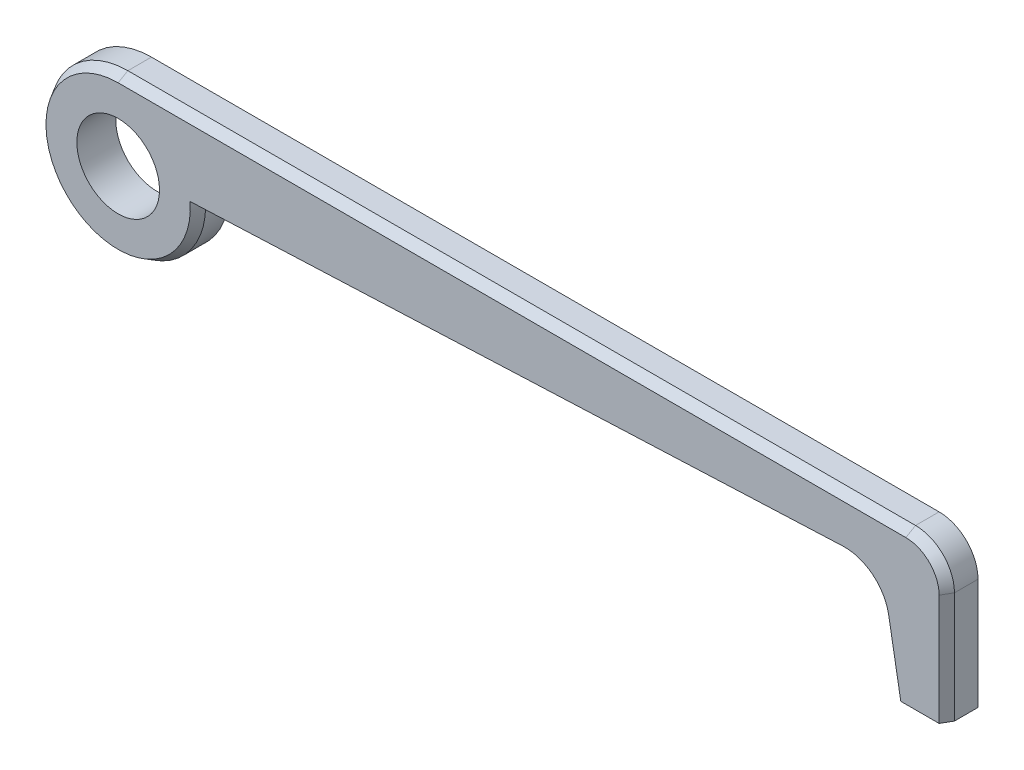
ISO-10303-21;
HEADER;
FILE_DESCRIPTION(('STEP AP214'),'2;1');
FILE_NAME('part.step','',(''),(''),'','','');
FILE_SCHEMA(('AUTOMOTIVE_DESIGN { 1 0 10303 214 1 1 1 1 }'));
ENDSEC;
DATA;
#1=APPLICATION_CONTEXT('core data for automotive mechanical design processes');
#2=APPLICATION_PROTOCOL_DEFINITION('international standard','automotive_design',2000,#1);
#3=PRODUCT_CONTEXT('',#1,'mechanical');
#4=PRODUCT('Part','Part','',(#3));
#5=PRODUCT_RELATED_PRODUCT_CATEGORY('part','',(#4));
#6=PRODUCT_DEFINITION_FORMATION('','',#4);
#7=PRODUCT_DEFINITION_CONTEXT('part definition',#1,'design');
#8=PRODUCT_DEFINITION('design','',#6,#7);
#9=PRODUCT_DEFINITION_SHAPE('','',#8);
#10=(LENGTH_UNIT() NAMED_UNIT(*) SI_UNIT(.MILLI.,.METRE.));
#11=(NAMED_UNIT(*) PLANE_ANGLE_UNIT() SI_UNIT($,.RADIAN.));
#12=(NAMED_UNIT(*) SI_UNIT($,.STERADIAN.) SOLID_ANGLE_UNIT());
#13=UNCERTAINTY_MEASURE_WITH_UNIT(LENGTH_MEASURE(1.E-05),#10,'distance_accuracy_value','');
#14=(GEOMETRIC_REPRESENTATION_CONTEXT(3) GLOBAL_UNCERTAINTY_ASSIGNED_CONTEXT((#13)) GLOBAL_UNIT_ASSIGNED_CONTEXT((#10,
#11,#12)) REPRESENTATION_CONTEXT('',''));
#15=CARTESIAN_POINT('',(0.,0.,0.));
#16=DIRECTION('',(0.,0.,1.));
#17=DIRECTION('',(1.,0.,0.));
#18=AXIS2_PLACEMENT_3D('',#15,#16,#17);
#19=CARTESIAN_POINT('',(81.,4.,4.));
#20=DIRECTION('',(0.,0.,-1.));
#21=DIRECTION('',(-1.,0.,0.));
#22=AXIS2_PLACEMENT_3D('',#19,#20,#21);
#23=PLANE('',#22);
#24=DIRECTION('',(0.173648177666926,-0.984807753012209,0.));
#25=VECTOR('',#24,1.);
#26=CARTESIAN_POINT('',(78.5466118509547,3.56740147517293,4.));
#27=LINE('',#26,#25);
#28=CARTESIAN_POINT('',(79.2376082910954,-0.351434073217302,4.));
#29=VERTEX_POINT('',#28);
#30=CARTESIAN_POINT('',(80.4844543979371,-7.42264973081036,4.));
#31=VERTEX_POINT('',#30);
#32=EDGE_CURVE('E53',#29,#31,#27,.T.);
#33=ORIENTED_EDGE('',*,*,#32,.T.);
#34=DIRECTION('',(1.,0.,0.));
#35=VECTOR('',#34,1.);
#36=CARTESIAN_POINT('',(81.,-7.42264973081036,4.));
#37=LINE('',#36,#35);
#38=CARTESIAN_POINT('',(84.4226497308104,-7.42264973081036,4.));
#39=VERTEX_POINT('',#38);
#40=EDGE_CURVE('E11',#31,#39,#37,.T.);
#41=ORIENTED_EDGE('',*,*,#40,.T.);
#42=DIRECTION('',(0.,1.,0.));
#43=VECTOR('',#42,1.);
#44=CARTESIAN_POINT('',(84.4226497308104,4.,4.));
#45=LINE('',#44,#43);
#46=CARTESIAN_POINT('',(84.4226497308104,4.,4.));
#47=VERTEX_POINT('',#46);
#48=EDGE_CURVE('E269',#39,#47,#45,.T.);
#49=ORIENTED_EDGE('',*,*,#48,.T.);
#50=CARTESIAN_POINT('',(81.,4.,4.));
#51=DIRECTION('',(0.,0.,-1.));
#52=DIRECTION('',(-1.,0.,0.));
#53=AXIS2_PLACEMENT_3D('',#50,#51,#52);
#54=CIRCLE('',#53,3.42264973081038);
#55=CARTESIAN_POINT('',(81.,7.42264973081038,4.));
#56=VERTEX_POINT('',#55);
#57=EDGE_CURVE('E267',#47,#56,#54,.F.);
#58=ORIENTED_EDGE('',*,*,#57,.T.);
#59=DIRECTION('',(-1.,0.,0.));
#60=VECTOR('',#59,1.);
#61=CARTESIAN_POINT('',(81.,7.42264973081038,4.));
#62=LINE('',#61,#60);
#63=CARTESIAN_POINT('',(0.,7.42264973081038,4.));
#64=VERTEX_POINT('',#63);
#65=EDGE_CURVE('E263',#56,#64,#62,.T.);
#66=ORIENTED_EDGE('',*,*,#65,.T.);
#67=CARTESIAN_POINT('',(0.,0.,4.));
#68=DIRECTION('',(0.,0.,-1.));
#69=DIRECTION('',(-1.,0.,0.));
#70=AXIS2_PLACEMENT_3D('',#67,#68,#69);
#71=CIRCLE('',#70,7.42264973081038);
#72=CARTESIAN_POINT('',(7.40207539489738,0.552276085444782,4.));
#73=VERTEX_POINT('',#72);
#74=EDGE_CURVE('E265',#64,#73,#71,.F.);
#75=ORIENTED_EDGE('',*,*,#74,.T.);
#76=DIRECTION('',(0.99908447434526,0.0427809901972354,0.));
#77=VECTOR('',#76,1.);
#78=CARTESIAN_POINT('',(81.0126621182814,3.70429562922719,4.));
#79=LINE('',#78,#77);
#80=CARTESIAN_POINT('',(74.5339746807494,3.42687698158216,4.));
#81=VERTEX_POINT('',#80);
#82=EDGE_CURVE('E271',#73,#81,#79,.T.);
#83=ORIENTED_EDGE('',*,*,#82,.T.);
#84=CARTESIAN_POINT('',(74.7297982577449,-1.14628260600531,4.));
#85=DIRECTION('',(0.,0.,-1.));
#86=DIRECTION('',(-1.,0.,0.));
#87=AXIS2_PLACEMENT_3D('',#84,#85,#86);
#88=CIRCLE('',#87,4.57735026918964);
#89=EDGE_CURVE('E64',#81,#29,#88,.T.);
#90=ORIENTED_EDGE('',*,*,#89,.T.);
#91=EDGE_LOOP('',(#33,#41,#49,#58,#66,#75,#83,#90));
#92=FACE_BOUND('',#91,.T.);
#93=CARTESIAN_POINT('',(0.,0.,4.));
#94=DIRECTION('',(0.,0.,1.));
#95=DIRECTION('',(1.,0.,0.));
#96=AXIS2_PLACEMENT_3D('',#93,#94,#95);
#97=CIRCLE('',#96,4.25);
#98=CARTESIAN_POINT('',(4.25,0.,4.));
#99=VERTEX_POINT('',#98);
#100=EDGE_CURVE('E389',#99,#99,#97,.T.);
#101=ORIENTED_EDGE('',*,*,#100,.F.);
#102=EDGE_LOOP('',(#101));
#103=FACE_BOUND('',#102,.T.);
#104=ADVANCED_FACE('F43',(#92,#103),#23,.F.);
#105=CARTESIAN_POINT('',(81.,4.,0.));
#106=DIRECTION('',(0.,0.,-1.));
#107=DIRECTION('',(-1.,0.,0.));
#108=AXIS2_PLACEMENT_3D('',#105,#106,#107);
#109=PLANE('',#108);
#110=DIRECTION('',(1.,0.,0.));
#111=VECTOR('',#110,1.);
#112=CARTESIAN_POINT('',(81.,6.99999999999998,0.));
#113=LINE('',#112,#111);
#114=CARTESIAN_POINT('',(0.,6.99999999999999,0.));
#115=VERTEX_POINT('',#114);
#116=CARTESIAN_POINT('',(81.,6.99999999999998,0.));
#117=VERTEX_POINT('',#116);
#118=EDGE_CURVE('E239',#115,#117,#113,.T.);
#119=ORIENTED_EDGE('',*,*,#118,.T.);
#120=CARTESIAN_POINT('',(81.,4.,0.));
#121=DIRECTION('',(0.,0.,-1.));
#122=DIRECTION('',(-1.,0.,0.));
#123=AXIS2_PLACEMENT_3D('',#120,#121,#122);
#124=CIRCLE('',#123,2.99999999999999);
#125=CARTESIAN_POINT('',(84.,4.,0.));
#126=VERTEX_POINT('',#125);
#127=EDGE_CURVE('E241',#117,#126,#124,.T.);
#128=ORIENTED_EDGE('',*,*,#127,.T.);
#129=DIRECTION('',(0.,-1.,0.));
#130=VECTOR('',#129,1.);
#131=CARTESIAN_POINT('',(84.,-7.99999999999999,0.));
#132=LINE('',#131,#130);
#133=CARTESIAN_POINT('',(84.,-7.42264973081036,0.));
#134=VERTEX_POINT('',#133);
#135=EDGE_CURVE('E236',#126,#134,#132,.T.);
#136=ORIENTED_EDGE('',*,*,#135,.T.);
#137=DIRECTION('',(-1.,0.,0.));
#138=VECTOR('',#137,1.);
#139=CARTESIAN_POINT('',(80.,-7.42264973081036,0.));
#140=LINE('',#139,#138);
#141=CARTESIAN_POINT('',(80.9136241821084,-7.42264973081036,0.));
#142=VERTEX_POINT('',#141);
#143=EDGE_CURVE('E226',#134,#142,#140,.T.);
#144=ORIENTED_EDGE('',*,*,#143,.T.);
#145=DIRECTION('',(-0.173648177666926,0.984807753012209,0.));
#146=VECTOR('',#145,1.);
#147=CARTESIAN_POINT('',(79.6538370228059,-0.278041717670662,0.));
#148=LINE('',#147,#146);
#149=CARTESIAN_POINT('',(79.6538370228059,-0.278041717670662,0.));
#150=VERTEX_POINT('',#149);
#151=EDGE_CURVE('E228',#142,#150,#148,.T.);
#152=ORIENTED_EDGE('',*,*,#151,.T.);
#153=CARTESIAN_POINT('',(74.7297982577449,-1.14628260600531,0.));
#154=DIRECTION('',(0.,0.,-1.));
#155=DIRECTION('',(-1.,0.,0.));
#156=AXIS2_PLACEMENT_3D('',#153,#154,#155);
#157=CIRCLE('',#156,5.00000000000002);
#158=CARTESIAN_POINT('',(74.5158933067587,3.84913976572101,0.));
#159=VERTEX_POINT('',#158);
#160=EDGE_CURVE('E230',#150,#159,#157,.F.);
#161=ORIENTED_EDGE('',*,*,#160,.T.);
#162=DIRECTION('',(-0.99908447434526,-0.0427809901972354,0.));
#163=VECTOR('',#162,1.);
#164=CARTESIAN_POINT('',(7.95721900980276,0.999084474345274,0.));
#165=LINE('',#164,#163);
#166=CARTESIAN_POINT('',(6.93450917493685,0.955291841646535,0.));
#167=VERTEX_POINT('',#166);
#168=EDGE_CURVE('E232',#159,#167,#165,.T.);
#169=ORIENTED_EDGE('',*,*,#168,.T.);
#170=CARTESIAN_POINT('',(0.,0.,0.));
#171=DIRECTION('',(0.,0.,-1.));
#172=DIRECTION('',(-1.,0.,0.));
#173=AXIS2_PLACEMENT_3D('',#170,#171,#172);
#174=CIRCLE('',#173,6.99999999999999);
#175=EDGE_CURVE('E234',#167,#115,#174,.T.);
#176=ORIENTED_EDGE('',*,*,#175,.T.);
#177=EDGE_LOOP('',(#119,#128,#136,#144,#152,#161,#169,#176));
#178=FACE_BOUND('',#177,.T.);
#179=CARTESIAN_POINT('',(0.,0.,0.));
#180=DIRECTION('',(0.,0.,1.));
#181=DIRECTION('',(1.,0.,0.));
#182=AXIS2_PLACEMENT_3D('',#179,#180,#181);
#183=CIRCLE('',#182,4.25);
#184=CARTESIAN_POINT('',(4.25,0.,0.));
#185=VERTEX_POINT('',#184);
#186=EDGE_CURVE('E383',#185,#185,#183,.T.);
#187=ORIENTED_EDGE('',*,*,#186,.T.);
#188=EDGE_LOOP('',(#187));
#189=FACE_BOUND('',#188,.T.);
#190=ADVANCED_FACE('F463',(#178,#189),#109,.T.);
#191=CARTESIAN_POINT('',(81.,4.,4.));
#192=DIRECTION('',(0.,0.,-1.));
#193=DIRECTION('',(-1.,0.,0.));
#194=AXIS2_PLACEMENT_3D('',#191,#192,#193);
#195=CYLINDRICAL_SURFACE('',#194,4.);
#196=DIRECTION('',(0.,0.,-1.));
#197=VECTOR('',#196,1.);
#198=CARTESIAN_POINT('',(85.,4.,4.));
#199=LINE('',#198,#197);
#200=CARTESIAN_POINT('',(85.,4.,3.));
#201=VERTEX_POINT('',#200);
#202=CARTESIAN_POINT('',(85.,4.,0.577350269189626));
#203=VERTEX_POINT('',#202);
#204=EDGE_CURVE('E394',#201,#203,#199,.T.);
#205=ORIENTED_EDGE('',*,*,#204,.T.);
#206=CARTESIAN_POINT('',(81.,4.,0.577350269189626));
#207=DIRECTION('',(0.,0.,-1.));
#208=DIRECTION('',(-1.,0.,0.));
#209=AXIS2_PLACEMENT_3D('',#206,#207,#208);
#210=CIRCLE('',#209,4.);
#211=CARTESIAN_POINT('',(81.,8.,0.577350269189626));
#212=VERTEX_POINT('',#211);
#213=EDGE_CURVE('E245',#203,#212,#210,.F.);
#214=ORIENTED_EDGE('',*,*,#213,.T.);
#215=DIRECTION('',(0.,0.,-1.));
#216=VECTOR('',#215,1.);
#217=CARTESIAN_POINT('',(81.,8.,4.));
#218=LINE('',#217,#216);
#219=CARTESIAN_POINT('',(81.,8.,3.));
#220=VERTEX_POINT('',#219);
#221=EDGE_CURVE('E204',#220,#212,#218,.T.);
#222=ORIENTED_EDGE('',*,*,#221,.F.);
#223=CARTESIAN_POINT('',(81.,4.,3.));
#224=DIRECTION('',(0.,0.,-1.));
#225=DIRECTION('',(-1.,0.,0.));
#226=AXIS2_PLACEMENT_3D('',#223,#224,#225);
#227=CIRCLE('',#226,4.);
#228=EDGE_CURVE('E243',#220,#201,#227,.T.);
#229=ORIENTED_EDGE('',*,*,#228,.T.);
#230=EDGE_LOOP('',(#205,#214,#222,#229));
#231=FACE_BOUND('',#230,.T.);
#232=ADVANCED_FACE('F491',(#231),#195,.T.);
#233=CARTESIAN_POINT('',(0.,8.,4.));
#234=DIRECTION('',(0.,-1.,0.));
#235=DIRECTION('',(1.,0.,0.));
#236=AXIS2_PLACEMENT_3D('',#233,#234,#235);
#237=PLANE('',#236);
#238=ORIENTED_EDGE('',*,*,#221,.T.);
#239=DIRECTION('',(-1.,0.,0.));
#240=VECTOR('',#239,1.);
#241=CARTESIAN_POINT('',(0.,8.,0.577350269189626));
#242=LINE('',#241,#240);
#243=CARTESIAN_POINT('',(0.,8.,0.577350269189626));
#244=VERTEX_POINT('',#243);
#245=EDGE_CURVE('E253',#212,#244,#242,.T.);
#246=ORIENTED_EDGE('',*,*,#245,.T.);
#247=DIRECTION('',(0.,0.,-1.));
#248=VECTOR('',#247,1.);
#249=CARTESIAN_POINT('',(0.,8.,4.));
#250=LINE('',#249,#248);
#251=CARTESIAN_POINT('',(0.,8.,3.));
#252=VERTEX_POINT('',#251);
#253=EDGE_CURVE('E207',#252,#244,#250,.T.);
#254=ORIENTED_EDGE('',*,*,#253,.F.);
#255=DIRECTION('',(1.,0.,0.));
#256=VECTOR('',#255,1.);
#257=CARTESIAN_POINT('',(0.,8.,3.));
#258=LINE('',#257,#256);
#259=EDGE_CURVE('E251',#252,#220,#258,.T.);
#260=ORIENTED_EDGE('',*,*,#259,.T.);
#261=EDGE_LOOP('',(#238,#246,#254,#260));
#262=FACE_BOUND('',#261,.T.);
#263=ADVANCED_FACE('F512',(#262),#237,.F.);
#264=CARTESIAN_POINT('',(0.,0.,4.));
#265=DIRECTION('',(0.,0.,-1.));
#266=DIRECTION('',(-1.,0.,0.));
#267=AXIS2_PLACEMENT_3D('',#264,#265,#266);
#268=CYLINDRICAL_SURFACE('',#267,8.);
#269=ORIENTED_EDGE('',*,*,#253,.T.);
#270=CARTESIAN_POINT('',(0.,0.,0.577350269189626));
#271=DIRECTION('',(0.,0.,-1.));
#272=DIRECTION('',(-1.,0.,0.));
#273=AXIS2_PLACEMENT_3D('',#270,#271,#272);
#274=CIRCLE('',#273,8.);
#275=CARTESIAN_POINT('',(8.,0.,0.577350269189626));
#276=VERTEX_POINT('',#275);
#277=EDGE_CURVE('E249',#244,#276,#274,.F.);
#278=ORIENTED_EDGE('',*,*,#277,.T.);
#279=DIRECTION('',(0.,0.,-1.));
#280=VECTOR('',#279,1.);
#281=CARTESIAN_POINT('',(8.,0.,4.));
#282=LINE('',#281,#280);
#283=CARTESIAN_POINT('',(8.,0.,3.));
#284=VERTEX_POINT('',#283);
#285=EDGE_CURVE('E405',#284,#276,#282,.T.);
#286=ORIENTED_EDGE('',*,*,#285,.F.);
#287=CARTESIAN_POINT('',(0.,0.,3.));
#288=DIRECTION('',(0.,0.,-1.));
#289=DIRECTION('',(-1.,0.,0.));
#290=AXIS2_PLACEMENT_3D('',#287,#288,#289);
#291=CIRCLE('',#290,8.);
#292=EDGE_CURVE('E247',#284,#252,#291,.T.);
#293=ORIENTED_EDGE('',*,*,#292,.T.);
#294=EDGE_LOOP('',(#269,#278,#286,#293));
#295=FACE_BOUND('',#294,.T.);
#296=ADVANCED_FACE('F411',(#295),#268,.T.);
#297=CARTESIAN_POINT('',(74.5586742969559,2.85005529137573,4.));
#298=DIRECTION('',(-0.0427809901972353,0.99908447434526,0.));
#299=DIRECTION('',(-0.99908447434526,-0.0427809901972353,0.));
#300=AXIS2_PLACEMENT_3D('',#297,#298,#299);
#301=PLANE('',#300);
#302=ORIENTED_EDGE('',*,*,#285,.T.);
#303=DIRECTION('',(0.99908447434526,0.0427809901972353,0.));
#304=VECTOR('',#303,1.);
#305=CARTESIAN_POINT('',(74.5586742969559,2.85005529137573,0.577350269189626));
#306=LINE('',#305,#304);
#307=CARTESIAN_POINT('',(74.5586742969559,2.85005529137573,0.577350269189626));
#308=VERTEX_POINT('',#307);
#309=EDGE_CURVE('E257',#276,#308,#306,.T.);
#310=ORIENTED_EDGE('',*,*,#309,.T.);
#311=DIRECTION('',(0.,0.,-1.));
#312=VECTOR('',#311,1.);
#313=CARTESIAN_POINT('',(74.5586742969559,2.85005529137573,4.));
#314=LINE('',#313,#312);
#315=CARTESIAN_POINT('',(74.5586742969559,2.85005529137573,2.99999999999997));
#316=VERTEX_POINT('',#315);
#317=EDGE_CURVE('E402',#316,#308,#314,.T.);
#318=ORIENTED_EDGE('',*,*,#317,.F.);
#319=DIRECTION('',(-0.99908447434526,-0.0427809901972353,0.));
#320=VECTOR('',#319,1.);
#321=CARTESIAN_POINT('',(74.5586742969559,2.85005529137573,2.99999999999997));
#322=LINE('',#321,#320);
#323=EDGE_CURVE('E255',#316,#284,#322,.T.);
#324=ORIENTED_EDGE('',*,*,#323,.T.);
#325=EDGE_LOOP('',(#302,#310,#318,#324));
#326=FACE_BOUND('',#325,.T.);
#327=ADVANCED_FACE('F430',(#326),#301,.F.);
#328=CARTESIAN_POINT('',(74.7297982577449,-1.14628260600531,4.));
#329=DIRECTION('',(0.,0.,-1.));
#330=DIRECTION('',(-1.,0.,0.));
#331=AXIS2_PLACEMENT_3D('',#328,#329,#330);
#332=CYLINDRICAL_SURFACE('',#331,4.);
#333=ORIENTED_EDGE('',*,*,#317,.T.);
#334=CARTESIAN_POINT('',(74.7297982577449,-1.14628260600531,0.577350269189626));
#335=DIRECTION('',(0.,0.,-1.));
#336=DIRECTION('',(-1.,0.,0.));
#337=AXIS2_PLACEMENT_3D('',#334,#335,#336);
#338=CIRCLE('',#337,4.);
#339=CARTESIAN_POINT('',(78.6690292697937,-0.451689895337592,0.577350269189626));
#340=VERTEX_POINT('',#339);
#341=EDGE_CURVE('E261',#308,#340,#338,.T.);
#342=ORIENTED_EDGE('',*,*,#341,.T.);
#343=DIRECTION('',(0.,0.,-1.));
#344=VECTOR('',#343,1.);
#345=CARTESIAN_POINT('',(78.6690292697937,-0.451689895337592,4.));
#346=LINE('',#345,#344);
#347=CARTESIAN_POINT('',(78.6690292697937,-0.451689895337592,2.99999999999997));
#348=VERTEX_POINT('',#347);
#349=EDGE_CURVE('E399',#348,#340,#346,.T.);
#350=ORIENTED_EDGE('',*,*,#349,.F.);
#351=CARTESIAN_POINT('',(74.7297982577449,-1.14628260600531,2.99999999999997));
#352=DIRECTION('',(0.,0.,-1.));
#353=DIRECTION('',(-1.,0.,0.));
#354=AXIS2_PLACEMENT_3D('',#351,#352,#353);
#355=CIRCLE('',#354,4.);
#356=EDGE_CURVE('E259',#348,#316,#355,.F.);
#357=ORIENTED_EDGE('',*,*,#356,.T.);
#358=EDGE_LOOP('',(#333,#342,#350,#357));
#359=FACE_BOUND('',#358,.T.);
#360=ADVANCED_FACE('F433',(#359),#332,.F.);
#361=CARTESIAN_POINT('',(80.,-7.99999999999999,4.));
#362=DIRECTION('',(0.984807753012209,0.173648177666926,0.));
#363=DIRECTION('',(-0.173648177666926,0.984807753012209,0.));
#364=AXIS2_PLACEMENT_3D('',#361,#362,#363);
#365=PLANE('',#364);
#366=ORIENTED_EDGE('',*,*,#349,.T.);
#367=DIRECTION('',(0.173648177666926,-0.984807753012209,0.));
#368=VECTOR('',#367,1.);
#369=CARTESIAN_POINT('',(80.,-7.99999999999999,0.577350269189626));
#370=LINE('',#369,#368);
#371=CARTESIAN_POINT('',(79.8263518223331,-7.01519224698777,0.577350269189626));
#372=VERTEX_POINT('',#371);
#373=EDGE_CURVE('E219',#340,#372,#370,.T.);
#374=ORIENTED_EDGE('',*,*,#373,.T.);
#375=DIRECTION('',(0.,0.,1.));
#376=VECTOR('',#375,1.);
#377=CARTESIAN_POINT('',(79.8263518223331,-7.01519224698777,4.));
#378=LINE('',#377,#376);
#379=CARTESIAN_POINT('',(79.8263518223331,-7.01519224698777,2.99999999999997));
#380=VERTEX_POINT('',#379);
#381=EDGE_CURVE('E216',#372,#380,#378,.T.);
#382=ORIENTED_EDGE('',*,*,#381,.T.);
#383=DIRECTION('',(-0.173648177666926,0.984807753012209,0.));
#384=VECTOR('',#383,1.);
#385=CARTESIAN_POINT('',(80.,-7.99999999999999,2.99999999999997));
#386=LINE('',#385,#384);
#387=EDGE_CURVE('E214',#380,#348,#386,.T.);
#388=ORIENTED_EDGE('',*,*,#387,.T.);
#389=EDGE_LOOP('',(#366,#374,#382,#388));
#390=FACE_BOUND('',#389,.T.);
#391=ADVANCED_FACE('F502',(#390),#365,.F.);
#392=CARTESIAN_POINT('',(85.,-7.99999999999999,4.));
#393=DIRECTION('',(0.,1.,0.));
#394=DIRECTION('',(0.,0.,1.));
#395=AXIS2_PLACEMENT_3D('',#392,#393,#394);
#396=PLANE('',#395);
#397=DIRECTION('',(-1.,0.,0.));
#398=VECTOR('',#397,1.);
#399=CARTESIAN_POINT('',(85.,-7.99999999999999,2.99999999999999));
#400=LINE('',#399,#398);
#401=CARTESIAN_POINT('',(84.,-7.99999999999999,2.99999999999999));
#402=VERTEX_POINT('',#401);
#403=CARTESIAN_POINT('',(80.6527036446661,-7.99999999999999,2.99999999999999));
#404=VERTEX_POINT('',#403);
#405=EDGE_CURVE('E173',#402,#404,#400,.T.);
#406=ORIENTED_EDGE('',*,*,#405,.T.);
#407=DIRECTION('',(0.,0.,-1.));
#408=VECTOR('',#407,1.);
#409=CARTESIAN_POINT('',(80.6527036446661,-7.99999999999999,4.));
#410=LINE('',#409,#408);
#411=CARTESIAN_POINT('',(80.6527036446661,-7.99999999999999,1.00000000000001));
#412=VERTEX_POINT('',#411);
#413=EDGE_CURVE('E212',#404,#412,#410,.T.);
#414=ORIENTED_EDGE('',*,*,#413,.T.);
#415=DIRECTION('',(1.,0.,0.));
#416=VECTOR('',#415,1.);
#417=CARTESIAN_POINT('',(85.,-7.99999999999999,1.00000000000001));
#418=LINE('',#417,#416);
#419=CARTESIAN_POINT('',(84.,-7.99999999999999,1.00000000000001));
#420=VERTEX_POINT('',#419);
#421=EDGE_CURVE('E176',#412,#420,#418,.T.);
#422=ORIENTED_EDGE('',*,*,#421,.T.);
#423=DIRECTION('',(0.,0.,1.));
#424=VECTOR('',#423,1.);
#425=CARTESIAN_POINT('',(84.,-7.99999999999999,4.));
#426=LINE('',#425,#424);
#427=EDGE_CURVE('E168',#420,#402,#426,.T.);
#428=ORIENTED_EDGE('',*,*,#427,.T.);
#429=EDGE_LOOP('',(#406,#414,#422,#428));
#430=FACE_BOUND('',#429,.T.);
#431=ADVANCED_FACE('F170',(#430),#396,.F.);
#432=CARTESIAN_POINT('',(85.,4.,4.));
#433=DIRECTION('',(-1.,0.,0.));
#434=DIRECTION('',(0.,0.,1.));
#435=AXIS2_PLACEMENT_3D('',#432,#433,#434);
#436=PLANE('',#435);
#437=DIRECTION('',(0.,0.,-1.));
#438=VECTOR('',#437,1.);
#439=CARTESIAN_POINT('',(85.,-7.42264973081036,4.));
#440=LINE('',#439,#438);
#441=CARTESIAN_POINT('',(85.,-7.42264973081036,3.));
#442=VERTEX_POINT('',#441);
#443=CARTESIAN_POINT('',(85.,-7.42264973081036,0.577350269189626));
#444=VERTEX_POINT('',#443);
#445=EDGE_CURVE('E186',#442,#444,#440,.T.);
#446=ORIENTED_EDGE('',*,*,#445,.T.);
#447=DIRECTION('',(0.,1.,0.));
#448=VECTOR('',#447,1.);
#449=CARTESIAN_POINT('',(85.,4.,0.577350269189626));
#450=LINE('',#449,#448);
#451=EDGE_CURVE('E224',#444,#203,#450,.T.);
#452=ORIENTED_EDGE('',*,*,#451,.T.);
#453=ORIENTED_EDGE('',*,*,#204,.F.);
#454=DIRECTION('',(0.,-1.,0.));
#455=VECTOR('',#454,1.);
#456=CARTESIAN_POINT('',(85.,4.,3.));
#457=LINE('',#456,#455);
#458=EDGE_CURVE('E221',#201,#442,#457,.T.);
#459=ORIENTED_EDGE('',*,*,#458,.T.);
#460=EDGE_LOOP('',(#446,#452,#453,#459));
#461=FACE_BOUND('',#460,.T.);
#462=ADVANCED_FACE('F496',(#461),#436,.F.);
#463=CARTESIAN_POINT('',(0.,0.,4.));
#464=DIRECTION('',(0.,0.,-1.));
#465=DIRECTION('',(-1.,0.,0.));
#466=AXIS2_PLACEMENT_3D('',#463,#464,#465);
#467=CYLINDRICAL_SURFACE('',#466,4.25);
#468=ORIENTED_EDGE('',*,*,#100,.T.);
#469=EDGE_LOOP('',(#468));
#470=FACE_BOUND('',#469,.T.);
#471=ORIENTED_EDGE('',*,*,#186,.F.);
#472=EDGE_LOOP('',(#471));
#473=FACE_BOUND('',#472,.T.);
#474=ADVANCED_FACE('F494',(#470,#473),#467,.F.);
#475=CARTESIAN_POINT('',(81.,7.42264973081038,4.));
#476=DIRECTION('',(0.,-0.866025403784441,-0.499999999999996));
#477=DIRECTION('',(-1.,0.,0.));
#478=AXIS2_PLACEMENT_3D('',#475,#476,#477);
#479=PLANE('',#478);
#480=DIRECTION('',(0.,-0.499999999999996,0.866025403784441));
#481=VECTOR('',#480,1.);
#482=CARTESIAN_POINT('',(81.,8.,3.));
#483=LINE('',#482,#481);
#484=EDGE_CURVE('E376',#220,#56,#483,.T.);
#485=ORIENTED_EDGE('',*,*,#484,.F.);
#486=ORIENTED_EDGE('',*,*,#259,.F.);
#487=DIRECTION('',(0.,0.499999999999996,-0.866025403784441));
#488=VECTOR('',#487,1.);
#489=CARTESIAN_POINT('',(0.,7.42264973081038,4.));
#490=LINE('',#489,#488);
#491=EDGE_CURVE('E48',#64,#252,#490,.T.);
#492=ORIENTED_EDGE('',*,*,#491,.F.);
#493=ORIENTED_EDGE('',*,*,#65,.F.);
#494=EDGE_LOOP('',(#485,#486,#492,#493));
#495=FACE_BOUND('',#494,.T.);
#496=ADVANCED_FACE('F46',(#495),#479,.F.);
#497=CARTESIAN_POINT('',(0.,8.,0.577350269189626));
#498=DIRECTION('',(0.,0.499999999999995,-0.866025403784442));
#499=DIRECTION('',(1.,0.,0.));
#500=AXIS2_PLACEMENT_3D('',#497,#498,#499);
#501=PLANE('',#500);
#502=DIRECTION('',(0.,-0.866025403784442,-0.499999999999995));
#503=VECTOR('',#502,1.);
#504=CARTESIAN_POINT('',(0.,8.,0.577350269189626));
#505=LINE('',#504,#503);
#506=EDGE_CURVE('E370',#244,#115,#505,.T.);
#507=ORIENTED_EDGE('',*,*,#506,.F.);
#508=ORIENTED_EDGE('',*,*,#245,.F.);
#509=DIRECTION('',(0.,0.866025403784442,0.499999999999995));
#510=VECTOR('',#509,1.);
#511=CARTESIAN_POINT('',(81.,6.99999999999998,0.));
#512=LINE('',#511,#510);
#513=EDGE_CURVE('E374',#117,#212,#512,.T.);
#514=ORIENTED_EDGE('',*,*,#513,.F.);
#515=ORIENTED_EDGE('',*,*,#118,.F.);
#516=EDGE_LOOP('',(#507,#508,#514,#515));
#517=FACE_BOUND('',#516,.T.);
#518=ADVANCED_FACE('F419',(#517),#501,.T.);
#519=CARTESIAN_POINT('',(0.,0.,4.));
#520=DIRECTION('',(0.,0.,-1.));
#521=DIRECTION('',(-1.,0.,0.));
#522=AXIS2_PLACEMENT_3D('',#519,#520,#521);
#523=CONICAL_SURFACE('',#522,7.42264973081038,0.523598775598294);
#524=ORIENTED_EDGE('',*,*,#491,.T.);
#525=ORIENTED_EDGE('',*,*,#292,.F.);
#526=CARTESIAN_POINT('',(8.,0.,3.));
#527=CARTESIAN_POINT('',(7.95154488824458,0.0464242482554917,3.08392600802668));
#528=CARTESIAN_POINT('',(7.90276501667539,0.0927559872493881,3.16771599633575));
#529=CARTESIAN_POINT('',(7.80453098496049,0.185220811682596,3.3350021739237));
#530=CARTESIAN_POINT('',(7.75507686205437,0.231353907909457,3.41849837911065));
#531=CARTESIAN_POINT('',(7.65546396730925,0.32341316802569,3.58518491397713));
#532=CARTESIAN_POINT('',(7.60530519170116,0.369339330806472,3.66837524201758));
#533=CARTESIAN_POINT('',(7.50425025414602,0.460974424125055,3.8344346247685));
#534=CARTESIAN_POINT('',(7.45335405178271,0.506683342572589,3.91730366155197));
#535=CARTESIAN_POINT('',(7.40207539489738,0.552276085444783,4.));
#536=B_SPLINE_CURVE_WITH_KNOTS('',3,(#526,#527,#528,#529,#530,#531,#532,#533,#534,#535),
.UNSPECIFIED.,.F.,.F.,(4,2,2,2,4),(0.,0.322366217253327,0.644714701437641,0.967064910469044,
1.28943285393488),.UNSPECIFIED.);
#537=EDGE_CURVE('E363',#73,#284,#536,.F.);
#538=ORIENTED_EDGE('',*,*,#537,.F.);
#539=ORIENTED_EDGE('',*,*,#74,.F.);
#540=EDGE_LOOP('',(#524,#525,#538,#539));
#541=FACE_BOUND('',#540,.T.);
#542=ADVANCED_FACE('F359',(#541),#523,.T.);
#543=CARTESIAN_POINT('',(81.,4.,4.));
#544=DIRECTION('',(0.,0.,-1.));
#545=DIRECTION('',(-1.,0.,0.));
#546=AXIS2_PLACEMENT_3D('',#543,#544,#545);
#547=CONICAL_SURFACE('',#546,3.42264973081038,0.523598775598292);
#548=ORIENTED_EDGE('',*,*,#484,.T.);
#549=ORIENTED_EDGE('',*,*,#57,.F.);
#550=DIRECTION('',(-0.499999999999996,0.,0.866025403784441));
#551=VECTOR('',#550,1.);
#552=CARTESIAN_POINT('',(85.,4.,3.));
#553=LINE('',#552,#551);
#554=EDGE_CURVE('E371',#201,#47,#553,.T.);
#555=ORIENTED_EDGE('',*,*,#554,.F.);
#556=ORIENTED_EDGE('',*,*,#228,.F.);
#557=EDGE_LOOP('',(#548,#549,#555,#556));
#558=FACE_BOUND('',#557,.T.);
#559=ADVANCED_FACE('F473',(#558),#547,.T.);
#560=CARTESIAN_POINT('',(81.,4.,0.577350269189626));
#561=DIRECTION('',(0.,0.,1.));
#562=DIRECTION('',(1.,0.,0.));
#563=AXIS2_PLACEMENT_3D('',#560,#561,#562);
#564=CONICAL_SURFACE('',#563,4.,1.0471975511966);
#565=ORIENTED_EDGE('',*,*,#513,.T.);
#566=ORIENTED_EDGE('',*,*,#213,.F.);
#567=DIRECTION('',(0.866025403784442,0.,0.499999999999995));
#568=VECTOR('',#567,1.);
#569=CARTESIAN_POINT('',(84.,4.,0.));
#570=LINE('',#569,#568);
#571=EDGE_CURVE('E316',#126,#203,#570,.T.);
#572=ORIENTED_EDGE('',*,*,#571,.F.);
#573=ORIENTED_EDGE('',*,*,#127,.F.);
#574=EDGE_LOOP('',(#565,#566,#572,#573));
#575=FACE_BOUND('',#574,.T.);
#576=ADVANCED_FACE('F469',(#575),#564,.T.);
#577=CARTESIAN_POINT('',(0.,0.,0.577350269189626));
#578=DIRECTION('',(0.,0.,1.));
#579=DIRECTION('',(1.,0.,0.));
#580=AXIS2_PLACEMENT_3D('',#577,#578,#579);
#581=CONICAL_SURFACE('',#580,8.,1.0471975511966);
#582=ORIENTED_EDGE('',*,*,#506,.T.);
#583=ORIENTED_EDGE('',*,*,#175,.F.);
#584=CARTESIAN_POINT('',(8.,0.,0.577350269189626));
#585=CARTESIAN_POINT('',(7.91426904767773,0.0821366636745368,0.527854538401581));
#586=CARTESIAN_POINT('',(7.8278127874648,0.163705737956558,0.478668290659739));
#587=CARTESIAN_POINT('',(7.65341155552637,0.325593683997525,0.380980168505512));
#588=CARTESIAN_POINT('',(7.56546701992183,0.40591290920634,0.332478100987598));
#589=CARTESIAN_POINT('',(7.387997660858,0.56523729671164,0.236192913438387));
#590=CARTESIAN_POINT('',(7.2984727636831,0.644242397375467,0.188409827137399));
#591=CARTESIAN_POINT('',(7.11775378510326,0.800851081967291,0.0936108515779761));
#592=CARTESIAN_POINT('',(7.02655922995955,0.878454255312517,0.0465951874514234));
#593=CARTESIAN_POINT('',(6.93450917493685,0.955291841646535,0.));
#594=B_SPLINE_CURVE_WITH_KNOTS('',3,(#584,#585,#586,#587,#588,#589,#590,#591,#592,#593),
.UNSPECIFIED.,.F.,.F.,(4,2,2,2,4),(0.,0.385893457599977,0.771675727464502,1.15747603985305,
1.54338756749755),.UNSPECIFIED.);
#595=EDGE_CURVE('E307',#276,#167,#594,.T.);
#596=ORIENTED_EDGE('',*,*,#595,.F.);
#597=ORIENTED_EDGE('',*,*,#277,.F.);
#598=EDGE_LOOP('',(#582,#583,#596,#597));
#599=FACE_BOUND('',#598,.T.);
#600=ADVANCED_FACE('F319',(#599),#581,.T.);
#601=CARTESIAN_POINT('',(81.0126621182814,3.70429562922719,4.));
#602=DIRECTION('',(-0.0370494243098589,0.865232535309619,-0.499999999999998));
#603=DIRECTION('',(0.99908447434526,0.0427809901972353,0.));
#604=AXIS2_PLACEMENT_3D('',#601,#602,#603);
#605=PLANE('',#604);
#606=ORIENTED_EDGE('',*,*,#537,.T.);
#607=ORIENTED_EDGE('',*,*,#323,.F.);
#608=DIRECTION('',(0.0213904950986191,-0.499542237172629,-0.866025403784439));
#609=VECTOR('',#608,1.);
#610=CARTESIAN_POINT('',(74.5339746807494,3.42687698158216,4.));
#611=LINE('',#610,#609);
#612=EDGE_CURVE('E304',#81,#316,#611,.T.);
#613=ORIENTED_EDGE('',*,*,#612,.F.);
#614=ORIENTED_EDGE('',*,*,#82,.F.);
#615=EDGE_LOOP('',(#606,#607,#613,#614));
#616=FACE_BOUND('',#615,.T.);
#617=ADVANCED_FACE('F350',(#616),#605,.F.);
#618=CARTESIAN_POINT('',(84.4226497308104,4.,4.));
#619=DIRECTION('',(-0.866025403784441,0.,-0.499999999999996));
#620=DIRECTION('',(0.,1.,0.));
#621=AXIS2_PLACEMENT_3D('',#618,#619,#620);
#622=PLANE('',#621);
#623=ORIENTED_EDGE('',*,*,#554,.T.);
#624=ORIENTED_EDGE('',*,*,#48,.F.);
#625=DIRECTION('',(0.499999999999996,0.,-0.866025403784441));
#626=VECTOR('',#625,1.);
#627=CARTESIAN_POINT('',(84.75,-7.42264973081036,3.43301270189221));
#628=LINE('',#627,#626);
#629=EDGE_CURVE('E190',#442,#39,#628,.F.);
#630=ORIENTED_EDGE('',*,*,#629,.F.);
#631=ORIENTED_EDGE('',*,*,#458,.F.);
#632=EDGE_LOOP('',(#623,#624,#630,#631));
#633=FACE_BOUND('',#632,.T.);
#634=ADVANCED_FACE('F344',(#633),#622,.F.);
#635=CARTESIAN_POINT('',(85.,-7.42264973081036,4.));
#636=DIRECTION('',(-0.499999999999995,0.866025403784441,0.));
#637=DIRECTION('',(0.,0.,-1.));
#638=AXIS2_PLACEMENT_3D('',#635,#636,#637);
#639=PLANE('',#638);
#640=DIRECTION('',(0.813259170127463,0.469535400794016,-0.343723769333447));
#641=VECTOR('',#640,1.);
#642=CARTESIAN_POINT('',(84.5,-7.71132486540518,0.78867513459482));
#643=LINE('',#642,#641);
#644=EDGE_CURVE('E191',#444,#420,#643,.F.);
#645=ORIENTED_EDGE('',*,*,#644,.F.);
#646=ORIENTED_EDGE('',*,*,#445,.F.);
#647=DIRECTION('',(-0.866025403784441,-0.499999999999995,0.));
#648=VECTOR('',#647,1.);
#649=CARTESIAN_POINT('',(84.,-7.99999999999999,2.99999999999999));
#650=LINE('',#649,#648);
#651=EDGE_CURVE('E183',#402,#442,#650,.F.);
#652=ORIENTED_EDGE('',*,*,#651,.F.);
#653=ORIENTED_EDGE('',*,*,#427,.F.);
#654=EDGE_LOOP('',(#645,#646,#652,#653));
#655=FACE_BOUND('',#654,.T.);
#656=ADVANCED_FACE('F185',(#655),#639,.F.);
#657=CARTESIAN_POINT('',(85.,4.,0.577350269189626));
#658=DIRECTION('',(0.499999999999995,0.,-0.866025403784442));
#659=DIRECTION('',(0.,-1.,0.));
#660=AXIS2_PLACEMENT_3D('',#657,#658,#659);
#661=PLANE('',#660);
#662=ORIENTED_EDGE('',*,*,#571,.T.);
#663=ORIENTED_EDGE('',*,*,#451,.F.);
#664=DIRECTION('',(0.866025403784442,0.,0.499999999999995));
#665=VECTOR('',#664,1.);
#666=CARTESIAN_POINT('',(84.,-7.42264973081036,0.));
#667=LINE('',#666,#665);
#668=EDGE_CURVE('E299',#134,#444,#667,.T.);
#669=ORIENTED_EDGE('',*,*,#668,.F.);
#670=ORIENTED_EDGE('',*,*,#135,.F.);
#671=EDGE_LOOP('',(#662,#663,#669,#670));
#672=FACE_BOUND('',#671,.T.);
#673=ADVANCED_FACE('F331',(#672),#661,.T.);
#674=CARTESIAN_POINT('',(74.5586742969559,2.85005529137573,0.577350269189626));
#675=DIRECTION('',(0.0213904950986174,-0.499542237172625,-0.866025403784442));
#676=DIRECTION('',(-0.99908447434526,-0.0427809901972353,0.));
#677=AXIS2_PLACEMENT_3D('',#674,#675,#676);
#678=PLANE('',#677);
#679=ORIENTED_EDGE('',*,*,#595,.T.);
#680=ORIENTED_EDGE('',*,*,#168,.F.);
#681=DIRECTION('',(-0.0370494243098589,0.86523253530962,-0.499999999999995));
#682=VECTOR('',#681,1.);
#683=CARTESIAN_POINT('',(74.5586742969559,2.85005529137573,0.577350269189626));
#684=LINE('',#683,#682);
#685=EDGE_CURVE('E296',#308,#159,#684,.T.);
#686=ORIENTED_EDGE('',*,*,#685,.F.);
#687=ORIENTED_EDGE('',*,*,#309,.F.);
#688=EDGE_LOOP('',(#679,#680,#686,#687));
#689=FACE_BOUND('',#688,.T.);
#690=ADVANCED_FACE('F323',(#689),#678,.T.);
#691=CARTESIAN_POINT('',(74.7297982577449,-1.14628260600531,4.));
#692=DIRECTION('',(0.,0.,1.));
#693=DIRECTION('',(1.,0.,0.));
#694=AXIS2_PLACEMENT_3D('',#691,#692,#693);
#695=CONICAL_SURFACE('',#694,4.57735026918964,0.523598775598296);
#696=ORIENTED_EDGE('',*,*,#612,.T.);
#697=ORIENTED_EDGE('',*,*,#356,.F.);
#698=DIRECTION('',(-0.492403876506101,-0.0868240888334629,-0.86602540378444));
#699=VECTOR('',#698,1.);
#700=CARTESIAN_POINT('',(79.2376082910954,-0.351434073217302,4.));
#701=LINE('',#700,#699);
#702=EDGE_CURVE('E197',#29,#348,#701,.T.);
#703=ORIENTED_EDGE('',*,*,#702,.F.);
#704=ORIENTED_EDGE('',*,*,#89,.F.);
#705=EDGE_LOOP('',(#696,#697,#703,#704));
#706=FACE_BOUND('',#705,.T.);
#707=ADVANCED_FACE('F330',(#706),#695,.F.);
#708=CARTESIAN_POINT('',(84.,-7.99999999999999,2.99999999999999));
#709=DIRECTION('',(0.480384461415255,-0.83205029433785,0.277350098112607));
#710=DIRECTION('',(0.866025403784443,0.499999999999992,0.));
#711=AXIS2_PLACEMENT_3D('',#708,#709,#710);
#712=PLANE('',#711);
#713=ORIENTED_EDGE('',*,*,#651,.T.);
#714=ORIENTED_EDGE('',*,*,#629,.T.);
#715=DIRECTION('',(0.343723769333452,0.469535400794015,0.813259170127461));
#716=VECTOR('',#715,1.);
#717=CARTESIAN_POINT('',(84.,-7.99999999999999,2.99999999999999));
#718=LINE('',#717,#716);
#719=EDGE_CURVE('E193',#402,#39,#718,.T.);
#720=ORIENTED_EDGE('',*,*,#719,.F.);
#721=EDGE_LOOP('',(#713,#714,#720));
#722=FACE_BOUND('',#721,.T.);
#723=ADVANCED_FACE('F194',(#722),#712,.T.);
#724=CARTESIAN_POINT('',(84.,-7.42264973081036,0.));
#725=DIRECTION('',(0.277350098112609,-0.832050294337848,-0.480384461415257));
#726=DIRECTION('',(0.,0.499999999999995,-0.866025403784442));
#727=AXIS2_PLACEMENT_3D('',#724,#725,#726);
#728=PLANE('',#727);
#729=ORIENTED_EDGE('',*,*,#668,.T.);
#730=ORIENTED_EDGE('',*,*,#644,.T.);
#731=DIRECTION('',(0.,0.499999999999995,-0.866025403784442));
#732=VECTOR('',#731,1.);
#733=CARTESIAN_POINT('',(84.,-7.42264973081036,0.));
#734=LINE('',#733,#732);
#735=EDGE_CURVE('E198',#134,#420,#734,.F.);
#736=ORIENTED_EDGE('',*,*,#735,.F.);
#737=EDGE_LOOP('',(#729,#730,#736));
#738=FACE_BOUND('',#737,.T.);
#739=ADVANCED_FACE('F458',(#738),#728,.T.);
#740=CARTESIAN_POINT('',(74.7297982577449,-1.14628260600531,0.577350269189626));
#741=DIRECTION('',(0.,0.,-1.));
#742=DIRECTION('',(-1.,0.,0.));
#743=AXIS2_PLACEMENT_3D('',#740,#741,#742);
#744=CONICAL_SURFACE('',#743,4.,1.04719755119661);
#745=ORIENTED_EDGE('',*,*,#685,.T.);
#746=ORIENTED_EDGE('',*,*,#160,.F.);
#747=DIRECTION('',(0.852868531952447,0.150383733180433,-0.499999999999994));
#748=VECTOR('',#747,1.);
#749=CARTESIAN_POINT('',(78.6690292697937,-0.451689895337592,0.577350269189626));
#750=LINE('',#749,#748);
#751=EDGE_CURVE('E289',#340,#150,#750,.T.);
#752=ORIENTED_EDGE('',*,*,#751,.F.);
#753=ORIENTED_EDGE('',*,*,#341,.F.);
#754=EDGE_LOOP('',(#745,#746,#752,#753));
#755=FACE_BOUND('',#754,.T.);
#756=ADVANCED_FACE('F554',(#755),#744,.F.);
#757=CARTESIAN_POINT('',(78.5466118509547,3.56740147517293,4.));
#758=DIRECTION('',(0.852868531952445,0.150383733180432,-0.499999999999998));
#759=DIRECTION('',(0.173648177666926,-0.984807753012209,0.));
#760=AXIS2_PLACEMENT_3D('',#757,#758,#759);
#761=PLANE('',#760);
#762=ORIENTED_EDGE('',*,*,#702,.T.);
#763=ORIENTED_EDGE('',*,*,#387,.F.);
#764=DIRECTION('',(0.520418805297426,-0.322211984576743,0.790786762716673));
#765=VECTOR('',#764,1.);
#766=CARTESIAN_POINT('',(79.8263518223331,-7.01519224698777,2.99999999999998));
#767=LINE('',#766,#765);
#768=EDGE_CURVE('E286',#31,#380,#767,.F.);
#769=ORIENTED_EDGE('',*,*,#768,.F.);
#770=ORIENTED_EDGE('',*,*,#32,.F.);
#771=EDGE_LOOP('',(#762,#763,#769,#770));
#772=FACE_BOUND('',#771,.T.);
#773=ADVANCED_FACE('F440',(#772),#761,.F.);
#774=CARTESIAN_POINT('',(81.,-7.42264973081036,4.));
#775=DIRECTION('',(0.,0.866025403784442,-0.499999999999995));
#776=DIRECTION('',(1.,0.,0.));
#777=AXIS2_PLACEMENT_3D('',#774,#775,#776);
#778=PLANE('',#777);
#779=ORIENTED_EDGE('',*,*,#719,.T.);
#780=ORIENTED_EDGE('',*,*,#40,.F.);
#781=DIRECTION('',(0.144185569083382,-0.494775333274629,-0.856976015563493));
#782=VECTOR('',#781,1.);
#783=CARTESIAN_POINT('',(80.5652685651064,-7.69996497635601,3.5196759050015));
#784=LINE('',#783,#782);
#785=EDGE_CURVE('E202',#404,#31,#784,.F.);
#786=ORIENTED_EDGE('',*,*,#785,.F.);
#787=ORIENTED_EDGE('',*,*,#405,.F.);
#788=EDGE_LOOP('',(#779,#780,#786,#787));
#789=FACE_BOUND('',#788,.T.);
#790=ADVANCED_FACE('F200',(#789),#778,.F.);
#791=CARTESIAN_POINT('',(85.,-7.99999999999999,1.00000000000001));
#792=DIRECTION('',(0.,-0.866025403784442,-0.499999999999995));
#793=DIRECTION('',(-1.,0.,0.));
#794=AXIS2_PLACEMENT_3D('',#791,#792,#793);
#795=PLANE('',#794);
#796=ORIENTED_EDGE('',*,*,#735,.T.);
#797=ORIENTED_EDGE('',*,*,#421,.F.);
#798=DIRECTION('',(-0.220406914640577,-0.487704006539469,0.844728118381276));
#799=VECTOR('',#798,1.);
#800=CARTESIAN_POINT('',(80.6527036446661,-7.99999999999999,1.00000000000001));
#801=LINE('',#800,#799);
#802=EDGE_CURVE('E282',#142,#412,#801,.T.);
#803=ORIENTED_EDGE('',*,*,#802,.F.);
#804=ORIENTED_EDGE('',*,*,#143,.F.);
#805=EDGE_LOOP('',(#796,#797,#803,#804));
#806=FACE_BOUND('',#805,.T.);
#807=ADVANCED_FACE('F454',(#806),#795,.T.);
#808=CARTESIAN_POINT('',(80.,-7.99999999999999,0.577350269189626));
#809=DIRECTION('',(-0.492403876506098,-0.0868240888334619,-0.866025403784443));
#810=DIRECTION('',(-0.173648177666926,0.984807753012209,0.));
#811=AXIS2_PLACEMENT_3D('',#808,#809,#810);
#812=PLANE('',#811);
#813=ORIENTED_EDGE('',*,*,#751,.T.);
#814=ORIENTED_EDGE('',*,*,#151,.F.);
#815=DIRECTION('',(0.83847058290795,-0.314218522065206,-0.445234547164931));
#816=VECTOR('',#815,1.);
#817=CARTESIAN_POINT('',(80.508982811579,-7.27100957073078,0.214867785518507));
#818=LINE('',#817,#816);
#819=EDGE_CURVE('E279',#372,#142,#818,.T.);
#820=ORIENTED_EDGE('',*,*,#819,.F.);
#821=ORIENTED_EDGE('',*,*,#373,.F.);
#822=EDGE_LOOP('',(#813,#814,#820,#821));
#823=FACE_BOUND('',#822,.T.);
#824=ADVANCED_FACE('F532',(#823),#812,.T.);
#825=CARTESIAN_POINT('',(79.8263518223331,-7.01519224698777,2.99999999999997));
#826=DIRECTION('',(-0.744513950072616,-0.62472138091226,0.235419146159249));
#827=DIRECTION('',(0.642787609686532,-0.766044443118984,0.));
#828=AXIS2_PLACEMENT_3D('',#825,#826,#827);
#829=PLANE('',#828);
#830=ORIENTED_EDGE('',*,*,#785,.T.);
#831=ORIENTED_EDGE('',*,*,#768,.T.);
#832=DIRECTION('',(-0.642787609686537,0.76604444311898,0.));
#833=VECTOR('',#832,1.);
#834=CARTESIAN_POINT('',(79.8263518223331,-7.01519224698778,2.99999999999995));
#835=LINE('',#834,#833);
#836=EDGE_CURVE('E277',#404,#380,#835,.T.);
#837=ORIENTED_EDGE('',*,*,#836,.F.);
#838=EDGE_LOOP('',(#830,#831,#837));
#839=FACE_BOUND('',#838,.T.);
#840=ADVANCED_FACE('F443',(#839),#829,.T.);
#841=CARTESIAN_POINT('',(80.6527036446661,-7.99999999999999,1.00000000000001));
#842=DIRECTION('',(-0.528479162189531,-0.668190438699337,-0.523670996678485));
#843=DIRECTION('',(0.784334183938173,-0.620338526859359,0.));
#844=AXIS2_PLACEMENT_3D('',#841,#842,#843);
#845=PLANE('',#844);
#846=ORIENTED_EDGE('',*,*,#819,.T.);
#847=ORIENTED_EDGE('',*,*,#802,.T.);
#848=DIRECTION('',(0.61063391364589,-0.727725160347357,0.312317650002232));
#849=VECTOR('',#848,1.);
#850=CARTESIAN_POINT('',(80.6527036446661,-7.99999999999999,1.00000000000001));
#851=LINE('',#850,#849);
#852=EDGE_CURVE('E275',#372,#412,#851,.T.);
#853=ORIENTED_EDGE('',*,*,#852,.F.);
#854=EDGE_LOOP('',(#846,#847,#853));
#855=FACE_BOUND('',#854,.T.);
#856=ADVANCED_FACE('F451',(#855),#845,.T.);
#857=CARTESIAN_POINT('',(80.6527036446661,-7.99999999999999,4.));
#858=DIRECTION('',(0.76604444311898,0.642787609686537,0.));
#859=DIRECTION('',(0.,0.,-1.));
#860=AXIS2_PLACEMENT_3D('',#857,#858,#859);
#861=PLANE('',#860);
#862=ORIENTED_EDGE('',*,*,#836,.T.);
#863=ORIENTED_EDGE('',*,*,#381,.F.);
#864=ORIENTED_EDGE('',*,*,#852,.T.);
#865=ORIENTED_EDGE('',*,*,#413,.F.);
#866=EDGE_LOOP('',(#862,#863,#864,#865));
#867=FACE_BOUND('',#866,.T.);
#868=ADVANCED_FACE('F447',(#867),#861,.F.);
#869=CLOSED_SHELL('',(#104,#190,#232,#263,#296,#327,#360,#391,#431,#462,#474,#496,#518,#542,
#559,#576,#600,#617,#634,#656,#673,#690,#707,#723,#739,#756,#773,#790,#807,#824,#840,#856,#868));
#870=MANIFOLD_SOLID_BREP('B2',#869);
#871=ADVANCED_BREP_SHAPE_REPRESENTATION('',(#18,#870),#14);
#872=SHAPE_DEFINITION_REPRESENTATION(#9,#871);
ENDSEC;
END-ISO-10303-21;
